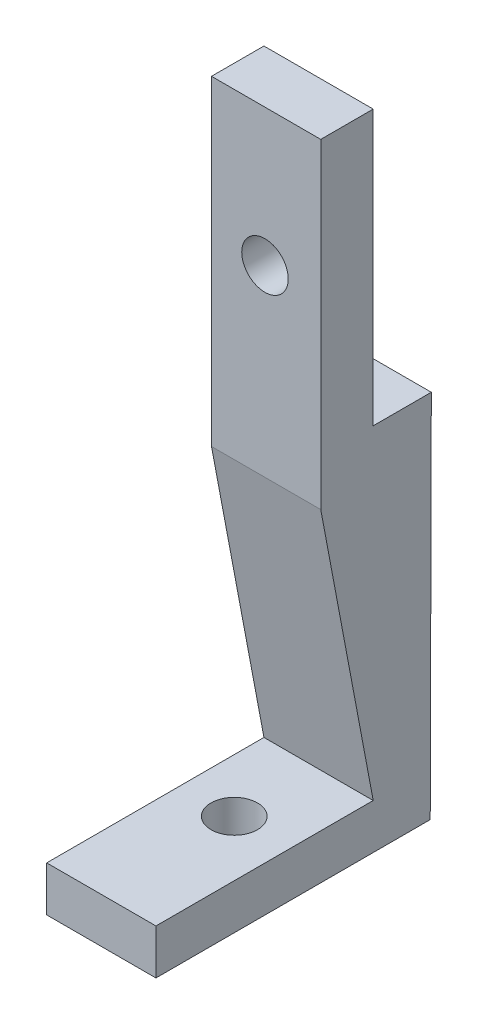
ISO-10303-21;
HEADER;
FILE_DESCRIPTION(('STEP AP214'),'2;1');
FILE_NAME('part.step','',(''),(''),'','','');
FILE_SCHEMA(('AUTOMOTIVE_DESIGN { 1 0 10303 214 1 1 1 1 }'));
ENDSEC;
DATA;
#1=APPLICATION_CONTEXT('core data for automotive mechanical design processes');
#2=APPLICATION_PROTOCOL_DEFINITION('international standard','automotive_design',2000,#1);
#3=PRODUCT_CONTEXT('',#1,'mechanical');
#4=PRODUCT('Part','Part','',(#3));
#5=PRODUCT_RELATED_PRODUCT_CATEGORY('part','',(#4));
#6=PRODUCT_DEFINITION_FORMATION('','',#4);
#7=PRODUCT_DEFINITION_CONTEXT('part definition',#1,'design');
#8=PRODUCT_DEFINITION('design','',#6,#7);
#9=PRODUCT_DEFINITION_SHAPE('','',#8);
#10=(LENGTH_UNIT() NAMED_UNIT(*) SI_UNIT(.MILLI.,.METRE.));
#11=(NAMED_UNIT(*) PLANE_ANGLE_UNIT() SI_UNIT($,.RADIAN.));
#12=(NAMED_UNIT(*) SI_UNIT($,.STERADIAN.) SOLID_ANGLE_UNIT());
#13=UNCERTAINTY_MEASURE_WITH_UNIT(LENGTH_MEASURE(1.E-05),#10,'distance_accuracy_value','');
#14=(GEOMETRIC_REPRESENTATION_CONTEXT(3) GLOBAL_UNCERTAINTY_ASSIGNED_CONTEXT((#13)) GLOBAL_UNIT_ASSIGNED_CONTEXT((#10,
#11,#12)) REPRESENTATION_CONTEXT('',''));
#15=CARTESIAN_POINT('',(0.,0.,0.));
#16=DIRECTION('',(0.,0.,1.));
#17=DIRECTION('',(1.,0.,0.));
#18=AXIS2_PLACEMENT_3D('',#15,#16,#17);
#19=CARTESIAN_POINT('',(4.7,27.6999999999997,4.70976625159633));
#20=DIRECTION('',(0.,-1.,0.));
#21=DIRECTION('',(0.,0.,-1.));
#22=AXIS2_PLACEMENT_3D('',#19,#20,#21);
#23=PLANE('',#22);
#24=DIRECTION('',(0.,0.,1.));
#25=VECTOR('',#24,1.);
#26=CARTESIAN_POINT('',(0.,27.6999999999997,4.70976625159633));
#27=LINE('',#26,#25);
#28=CARTESIAN_POINT('',(0.,27.6999999999997,2.45350347609655));
#29=VERTEX_POINT('',#28);
#30=CARTESIAN_POINT('',(0.,27.6999999999997,4.70976625159633));
#31=VERTEX_POINT('',#30);
#32=EDGE_CURVE('E143',#29,#31,#27,.T.);
#33=ORIENTED_EDGE('',*,*,#32,.T.);
#34=DIRECTION('',(-1.,0.,0.));
#35=VECTOR('',#34,1.);
#36=CARTESIAN_POINT('',(4.7,27.6999999999997,4.70976625159633));
#37=LINE('',#36,#35);
#38=CARTESIAN_POINT('',(4.7,27.6999999999997,4.70976625159633));
#39=VERTEX_POINT('',#38);
#40=EDGE_CURVE('E11',#39,#31,#37,.T.);
#41=ORIENTED_EDGE('',*,*,#40,.F.);
#42=DIRECTION('',(0.,0.,1.));
#43=VECTOR('',#42,1.);
#44=CARTESIAN_POINT('',(4.7,27.6999999999997,4.70976625159633));
#45=LINE('',#44,#43);
#46=CARTESIAN_POINT('',(4.7,27.6999999999997,2.45350347609655));
#47=VERTEX_POINT('',#46);
#48=EDGE_CURVE('E158',#47,#39,#45,.T.);
#49=ORIENTED_EDGE('',*,*,#48,.F.);
#50=DIRECTION('',(-1.,0.,0.));
#51=VECTOR('',#50,1.);
#52=CARTESIAN_POINT('',(4.7,27.6999999999997,2.45350347609655));
#53=LINE('',#52,#51);
#54=EDGE_CURVE('E140',#47,#29,#53,.T.);
#55=ORIENTED_EDGE('',*,*,#54,.T.);
#56=EDGE_LOOP('',(#33,#41,#49,#55));
#57=FACE_BOUND('',#56,.T.);
#58=ADVANCED_FACE('F39',(#57),#23,.F.);
#59=CARTESIAN_POINT('',(4.7,13.9090769259345,4.70976625159633));
#60=DIRECTION('',(0.,0.,-1.));
#61=DIRECTION('',(-1.,0.,0.));
#62=AXIS2_PLACEMENT_3D('',#59,#60,#61);
#63=PLANE('',#62);
#64=CARTESIAN_POINT('',(2.29999999999601,21.8000000000001,4.70976625159633));
#65=DIRECTION('',(0.,0.,-1.));
#66=DIRECTION('',(-1.,0.,0.));
#67=AXIS2_PLACEMENT_3D('',#64,#65,#66);
#68=CIRCLE('',#67,0.999999999995538);
#69=CARTESIAN_POINT('',(1.30000000000047,21.8000000000001,4.70976625159633));
#70=VERTEX_POINT('',#69);
#71=EDGE_CURVE('E144',#70,#70,#68,.T.);
#72=ORIENTED_EDGE('',*,*,#71,.T.);
#73=EDGE_LOOP('',(#72));
#74=FACE_BOUND('',#73,.T.);
#75=DIRECTION('',(0.,-1.,0.));
#76=VECTOR('',#75,1.);
#77=CARTESIAN_POINT('',(0.,13.9090769259345,4.70976625159633));
#78=LINE('',#77,#76);
#79=CARTESIAN_POINT('',(0.,13.9090769259345,4.70976625159633));
#80=VERTEX_POINT('',#79);
#81=EDGE_CURVE('E145',#31,#80,#78,.T.);
#82=ORIENTED_EDGE('',*,*,#81,.T.);
#83=DIRECTION('',(-1.,0.,0.));
#84=VECTOR('',#83,1.);
#85=CARTESIAN_POINT('',(4.7,13.9090769259345,4.70976625159633));
#86=LINE('',#85,#84);
#87=CARTESIAN_POINT('',(4.7,13.9090769259345,4.70976625159633));
#88=VERTEX_POINT('',#87);
#89=EDGE_CURVE('E50',#88,#80,#86,.T.);
#90=ORIENTED_EDGE('',*,*,#89,.F.);
#91=DIRECTION('',(0.,-1.,0.));
#92=VECTOR('',#91,1.);
#93=CARTESIAN_POINT('',(4.7,13.9090769259345,4.70976625159633));
#94=LINE('',#93,#92);
#95=EDGE_CURVE('E101',#39,#88,#94,.T.);
#96=ORIENTED_EDGE('',*,*,#95,.F.);
#97=ORIENTED_EDGE('',*,*,#40,.T.);
#98=EDGE_LOOP('',(#82,#90,#96,#97));
#99=FACE_BOUND('',#98,.T.);
#100=ADVANCED_FACE('F237',(#74,#99),#63,.F.);
#101=CARTESIAN_POINT('',(4.7,13.9090769259345,4.70976625159633));
#102=DIRECTION('',(0.,0.185238207740741,-0.982693648291775));
#103=DIRECTION('',(0.,0.982693648291775,0.185238207740741));
#104=AXIS2_PLACEMENT_3D('',#101,#102,#103);
#105=PLANE('',#104);
#106=DIRECTION('',(0.,-0.982693648291775,-0.185238207740741));
#107=VECTOR('',#106,1.);
#108=CARTESIAN_POINT('',(0.,13.9090769259345,4.70976625159633));
#109=LINE('',#108,#107);
#110=CARTESIAN_POINT('',(0.,1.93954253341857,2.45350347609655));
#111=VERTEX_POINT('',#110);
#112=EDGE_CURVE('E150',#80,#111,#109,.T.);
#113=ORIENTED_EDGE('',*,*,#112,.T.);
#114=DIRECTION('',(-1.,0.,0.));
#115=VECTOR('',#114,1.);
#116=CARTESIAN_POINT('',(4.7,1.93954253341857,2.45350347609655));
#117=LINE('',#116,#115);
#118=CARTESIAN_POINT('',(4.7,1.93954253341857,2.45350347609655));
#119=VERTEX_POINT('',#118);
#120=EDGE_CURVE('E169',#119,#111,#117,.T.);
#121=ORIENTED_EDGE('',*,*,#120,.F.);
#122=DIRECTION('',(0.,-0.982693648291775,-0.185238207740741));
#123=VECTOR('',#122,1.);
#124=CARTESIAN_POINT('',(4.7,13.9090769259345,4.70976625159633));
#125=LINE('',#124,#123);
#126=EDGE_CURVE('E177',#88,#119,#125,.T.);
#127=ORIENTED_EDGE('',*,*,#126,.F.);
#128=ORIENTED_EDGE('',*,*,#89,.T.);
#129=EDGE_LOOP('',(#113,#121,#127,#128));
#130=FACE_BOUND('',#129,.T.);
#131=ADVANCED_FACE('F173',(#130),#105,.F.);
#132=CARTESIAN_POINT('',(4.7,1.93954253341857,11.8));
#133=DIRECTION('',(0.,-1.,0.));
#134=DIRECTION('',(0.,0.,-1.));
#135=AXIS2_PLACEMENT_3D('',#132,#133,#134);
#136=PLANE('',#135);
#137=CARTESIAN_POINT('',(2.29999999999615,1.93954253341857,6.03102558482396));
#138=DIRECTION('',(0.,-1.,0.));
#139=DIRECTION('',(0.,0.,-1.));
#140=AXIS2_PLACEMENT_3D('',#137,#138,#139);
#141=CIRCLE('',#140,0.999999999999455);
#142=CARTESIAN_POINT('',(2.29999999999615,1.93954253341857,5.0310255848245));
#143=VERTEX_POINT('',#142);
#144=EDGE_CURVE('E204',#143,#143,#141,.T.);
#145=ORIENTED_EDGE('',*,*,#144,.T.);
#146=EDGE_LOOP('',(#145));
#147=FACE_BOUND('',#146,.T.);
#148=DIRECTION('',(0.,0.,1.));
#149=VECTOR('',#148,1.);
#150=CARTESIAN_POINT('',(0.,1.93954253341857,11.8));
#151=LINE('',#150,#149);
#152=CARTESIAN_POINT('',(0.,1.93954253341857,11.8));
#153=VERTEX_POINT('',#152);
#154=EDGE_CURVE('E149',#111,#153,#151,.T.);
#155=ORIENTED_EDGE('',*,*,#154,.T.);
#156=DIRECTION('',(-1.,0.,0.));
#157=VECTOR('',#156,1.);
#158=CARTESIAN_POINT('',(4.7,1.93954253341857,11.8));
#159=LINE('',#158,#157);
#160=CARTESIAN_POINT('',(4.7,1.93954253341857,11.8));
#161=VERTEX_POINT('',#160);
#162=EDGE_CURVE('E164',#161,#153,#159,.T.);
#163=ORIENTED_EDGE('',*,*,#162,.F.);
#164=DIRECTION('',(0.,0.,1.));
#165=VECTOR('',#164,1.);
#166=CARTESIAN_POINT('',(4.7,1.93954253341857,11.8));
#167=LINE('',#166,#165);
#168=EDGE_CURVE('E195',#119,#161,#167,.T.);
#169=ORIENTED_EDGE('',*,*,#168,.F.);
#170=ORIENTED_EDGE('',*,*,#120,.T.);
#171=EDGE_LOOP('',(#155,#163,#169,#170));
#172=FACE_BOUND('',#171,.T.);
#173=ADVANCED_FACE('F183',(#147,#172),#136,.F.);
#174=CARTESIAN_POINT('',(4.7,0.,11.8));
#175=DIRECTION('',(0.,0.,-1.));
#176=DIRECTION('',(-1.,0.,0.));
#177=AXIS2_PLACEMENT_3D('',#174,#175,#176);
#178=PLANE('',#177);
#179=DIRECTION('',(0.,-1.,0.));
#180=VECTOR('',#179,1.);
#181=CARTESIAN_POINT('',(0.,0.,11.8));
#182=LINE('',#181,#180);
#183=CARTESIAN_POINT('',(0.,0.,11.8));
#184=VERTEX_POINT('',#183);
#185=EDGE_CURVE('E151',#153,#184,#182,.T.);
#186=ORIENTED_EDGE('',*,*,#185,.T.);
#187=DIRECTION('',(-1.,0.,0.));
#188=VECTOR('',#187,1.);
#189=CARTESIAN_POINT('',(4.7,0.,11.8));
#190=LINE('',#189,#188);
#191=CARTESIAN_POINT('',(4.7,0.,11.8));
#192=VERTEX_POINT('',#191);
#193=EDGE_CURVE('E165',#192,#184,#190,.T.);
#194=ORIENTED_EDGE('',*,*,#193,.F.);
#195=DIRECTION('',(0.,-1.,0.));
#196=VECTOR('',#195,1.);
#197=CARTESIAN_POINT('',(4.7,0.,11.8));
#198=LINE('',#197,#196);
#199=EDGE_CURVE('E192',#161,#192,#198,.T.);
#200=ORIENTED_EDGE('',*,*,#199,.F.);
#201=ORIENTED_EDGE('',*,*,#162,.T.);
#202=EDGE_LOOP('',(#186,#194,#200,#201));
#203=FACE_BOUND('',#202,.T.);
#204=ADVANCED_FACE('F188',(#203),#178,.F.);
#205=CARTESIAN_POINT('',(4.7,0.,0.));
#206=DIRECTION('',(0.,1.,0.));
#207=DIRECTION('',(0.,0.,1.));
#208=AXIS2_PLACEMENT_3D('',#205,#206,#207);
#209=PLANE('',#208);
#210=CARTESIAN_POINT('',(2.29999999999615,0.,6.03102558482396));
#211=DIRECTION('',(0.,-1.,0.));
#212=DIRECTION('',(0.,0.,-1.));
#213=AXIS2_PLACEMENT_3D('',#210,#211,#212);
#214=CIRCLE('',#213,0.999999999999455);
#215=CARTESIAN_POINT('',(2.29999999999615,0.,5.0310255848245));
#216=VERTEX_POINT('',#215);
#217=EDGE_CURVE('E210',#216,#216,#214,.T.);
#218=ORIENTED_EDGE('',*,*,#217,.F.);
#219=EDGE_LOOP('',(#218));
#220=FACE_BOUND('',#219,.T.);
#221=DIRECTION('',(0.,0.,-1.));
#222=VECTOR('',#221,1.);
#223=CARTESIAN_POINT('',(0.,0.,0.));
#224=LINE('',#223,#222);
#225=CARTESIAN_POINT('',(0.,0.,0.));
#226=VERTEX_POINT('',#225);
#227=EDGE_CURVE('E153',#184,#226,#224,.T.);
#228=ORIENTED_EDGE('',*,*,#227,.T.);
#229=DIRECTION('',(-1.,0.,0.));
#230=VECTOR('',#229,1.);
#231=CARTESIAN_POINT('',(4.7,0.,0.));
#232=LINE('',#231,#230);
#233=CARTESIAN_POINT('',(4.7,0.,0.));
#234=VERTEX_POINT('',#233);
#235=EDGE_CURVE('E132',#234,#226,#232,.T.);
#236=ORIENTED_EDGE('',*,*,#235,.F.);
#237=DIRECTION('',(0.,0.,-1.));
#238=VECTOR('',#237,1.);
#239=CARTESIAN_POINT('',(4.7,0.,0.));
#240=LINE('',#239,#238);
#241=EDGE_CURVE('E124',#192,#234,#240,.T.);
#242=ORIENTED_EDGE('',*,*,#241,.F.);
#243=ORIENTED_EDGE('',*,*,#193,.T.);
#244=EDGE_LOOP('',(#228,#236,#242,#243));
#245=FACE_BOUND('',#244,.T.);
#246=ADVANCED_FACE('F212',(#220,#245),#209,.F.);
#247=CARTESIAN_POINT('',(4.7,15.8999999999996,-0.0464965239034536));
#248=DIRECTION('',(0.,0.00292429717579829,0.999995724233873));
#249=DIRECTION('',(0.,-0.999995724233873,0.00292429717579829));
#250=AXIS2_PLACEMENT_3D('',#247,#248,#249);
#251=PLANE('',#250);
#252=DIRECTION('',(0.,0.999995724233873,-0.00292429717579829));
#253=VECTOR('',#252,1.);
#254=CARTESIAN_POINT('',(0.,15.8999999999996,-0.0464965239034536));
#255=LINE('',#254,#253);
#256=CARTESIAN_POINT('',(0.,15.8999999999996,-0.0464965239034536));
#257=VERTEX_POINT('',#256);
#258=EDGE_CURVE('E131',#226,#257,#255,.T.);
#259=ORIENTED_EDGE('',*,*,#258,.T.);
#260=DIRECTION('',(-1.,0.,0.));
#261=VECTOR('',#260,1.);
#262=CARTESIAN_POINT('',(4.7,15.8999999999996,-0.0464965239034536));
#263=LINE('',#262,#261);
#264=CARTESIAN_POINT('',(4.7,15.8999999999996,-0.0464965239034536));
#265=VERTEX_POINT('',#264);
#266=EDGE_CURVE('E126',#265,#257,#263,.T.);
#267=ORIENTED_EDGE('',*,*,#266,.F.);
#268=DIRECTION('',(0.,0.999995724233873,-0.00292429717579829));
#269=VECTOR('',#268,1.);
#270=CARTESIAN_POINT('',(4.7,15.8999999999996,-0.0464965239034536));
#271=LINE('',#270,#269);
#272=EDGE_CURVE('E117',#234,#265,#271,.T.);
#273=ORIENTED_EDGE('',*,*,#272,.F.);
#274=ORIENTED_EDGE('',*,*,#235,.T.);
#275=EDGE_LOOP('',(#259,#267,#273,#274));
#276=FACE_BOUND('',#275,.T.);
#277=ADVANCED_FACE('F129',(#276),#251,.F.);
#278=CARTESIAN_POINT('',(4.7,15.8999999999996,2.45350347609654));
#279=DIRECTION('',(0.,-1.,0.));
#280=DIRECTION('',(0.,0.,-1.));
#281=AXIS2_PLACEMENT_3D('',#278,#279,#280);
#282=PLANE('',#281);
#283=DIRECTION('',(0.,0.,1.));
#284=VECTOR('',#283,1.);
#285=CARTESIAN_POINT('',(0.,15.8999999999996,2.45350347609654));
#286=LINE('',#285,#284);
#287=CARTESIAN_POINT('',(0.,15.8999999999996,2.45350347609654));
#288=VERTEX_POINT('',#287);
#289=EDGE_CURVE('E87',#257,#288,#286,.T.);
#290=ORIENTED_EDGE('',*,*,#289,.T.);
#291=DIRECTION('',(-1.,0.,0.));
#292=VECTOR('',#291,1.);
#293=CARTESIAN_POINT('',(4.7,15.8999999999996,2.45350347609654));
#294=LINE('',#293,#292);
#295=CARTESIAN_POINT('',(4.7,15.8999999999996,2.45350347609654));
#296=VERTEX_POINT('',#295);
#297=EDGE_CURVE('E134',#296,#288,#294,.T.);
#298=ORIENTED_EDGE('',*,*,#297,.F.);
#299=DIRECTION('',(0.,0.,1.));
#300=VECTOR('',#299,1.);
#301=CARTESIAN_POINT('',(4.7,15.8999999999996,2.45350347609654));
#302=LINE('',#301,#300);
#303=EDGE_CURVE('E122',#265,#296,#302,.T.);
#304=ORIENTED_EDGE('',*,*,#303,.F.);
#305=ORIENTED_EDGE('',*,*,#266,.T.);
#306=EDGE_LOOP('',(#290,#298,#304,#305));
#307=FACE_BOUND('',#306,.T.);
#308=ADVANCED_FACE('F135',(#307),#282,.F.);
#309=CARTESIAN_POINT('',(4.7,27.6999999999997,2.45350347609655));
#310=DIRECTION('',(0.,0.,1.));
#311=DIRECTION('',(0.,-1.,0.));
#312=AXIS2_PLACEMENT_3D('',#309,#310,#311);
#313=PLANE('',#312);
#314=CARTESIAN_POINT('',(2.29999999999601,21.8000000000001,2.45350347609654));
#315=DIRECTION('',(0.,0.,-1.));
#316=DIRECTION('',(0.,1.,0.));
#317=AXIS2_PLACEMENT_3D('',#314,#315,#316);
#318=CIRCLE('',#317,0.999999999995538);
#319=CARTESIAN_POINT('',(2.29999999999601,22.7999999999956,2.45350347609654));
#320=VERTEX_POINT('',#319);
#321=EDGE_CURVE('E203',#320,#320,#318,.T.);
#322=ORIENTED_EDGE('',*,*,#321,.F.);
#323=EDGE_LOOP('',(#322));
#324=FACE_BOUND('',#323,.T.);
#325=DIRECTION('',(0.,1.,0.));
#326=VECTOR('',#325,1.);
#327=CARTESIAN_POINT('',(0.,27.6999999999997,2.45350347609655));
#328=LINE('',#327,#326);
#329=EDGE_CURVE('E91',#288,#29,#328,.T.);
#330=ORIENTED_EDGE('',*,*,#329,.T.);
#331=ORIENTED_EDGE('',*,*,#54,.F.);
#332=DIRECTION('',(0.,1.,0.));
#333=VECTOR('',#332,1.);
#334=CARTESIAN_POINT('',(4.7,27.6999999999997,2.45350347609655));
#335=LINE('',#334,#333);
#336=EDGE_CURVE('E54',#296,#47,#335,.T.);
#337=ORIENTED_EDGE('',*,*,#336,.F.);
#338=ORIENTED_EDGE('',*,*,#297,.T.);
#339=EDGE_LOOP('',(#330,#331,#337,#338));
#340=FACE_BOUND('',#339,.T.);
#341=ADVANCED_FACE('F222',(#324,#340),#313,.F.);
#342=CARTESIAN_POINT('',(4.7,0.,0.));
#343=DIRECTION('',(-1.,0.,0.));
#344=DIRECTION('',(0.,0.,1.));
#345=AXIS2_PLACEMENT_3D('',#342,#343,#344);
#346=PLANE('',#345);
#347=ORIENTED_EDGE('',*,*,#48,.T.);
#348=ORIENTED_EDGE('',*,*,#95,.T.);
#349=ORIENTED_EDGE('',*,*,#126,.T.);
#350=ORIENTED_EDGE('',*,*,#168,.T.);
#351=ORIENTED_EDGE('',*,*,#199,.T.);
#352=ORIENTED_EDGE('',*,*,#241,.T.);
#353=ORIENTED_EDGE('',*,*,#272,.T.);
#354=ORIENTED_EDGE('',*,*,#303,.T.);
#355=ORIENTED_EDGE('',*,*,#336,.T.);
#356=EDGE_LOOP('',(#347,#348,#349,#350,#351,#352,#353,#354,#355));
#357=FACE_BOUND('',#356,.T.);
#358=ADVANCED_FACE('F118',(#357),#346,.F.);
#359=CARTESIAN_POINT('',(0.,0.,0.));
#360=DIRECTION('',(-1.,0.,0.));
#361=DIRECTION('',(0.,0.,1.));
#362=AXIS2_PLACEMENT_3D('',#359,#360,#361);
#363=PLANE('',#362);
#364=ORIENTED_EDGE('',*,*,#32,.F.);
#365=ORIENTED_EDGE('',*,*,#329,.F.);
#366=ORIENTED_EDGE('',*,*,#289,.F.);
#367=ORIENTED_EDGE('',*,*,#258,.F.);
#368=ORIENTED_EDGE('',*,*,#227,.F.);
#369=ORIENTED_EDGE('',*,*,#185,.F.);
#370=ORIENTED_EDGE('',*,*,#154,.F.);
#371=ORIENTED_EDGE('',*,*,#112,.F.);
#372=ORIENTED_EDGE('',*,*,#81,.F.);
#373=EDGE_LOOP('',(#364,#365,#366,#367,#368,#369,#370,#371,#372));
#374=FACE_BOUND('',#373,.T.);
#375=ADVANCED_FACE('F178',(#374),#363,.T.);
#376=CARTESIAN_POINT('',(2.29999999999601,21.8000000000001,7.15350347609654));
#377=DIRECTION('',(0.,0.,-1.));
#378=DIRECTION('',(0.,1.,0.));
#379=AXIS2_PLACEMENT_3D('',#376,#377,#378);
#380=CYLINDRICAL_SURFACE('',#379,0.999999999995538);
#381=ORIENTED_EDGE('',*,*,#321,.T.);
#382=EDGE_LOOP('',(#381));
#383=FACE_BOUND('',#382,.T.);
#384=ORIENTED_EDGE('',*,*,#71,.F.);
#385=EDGE_LOOP('',(#384));
#386=FACE_BOUND('',#385,.T.);
#387=ADVANCED_FACE('F267',(#383,#386),#380,.F.);
#388=CARTESIAN_POINT('',(2.29999999999615,4.7,6.03102558482396));
#389=DIRECTION('',(0.,-1.,0.));
#390=DIRECTION('',(0.,0.,-1.));
#391=AXIS2_PLACEMENT_3D('',#388,#389,#390);
#392=CYLINDRICAL_SURFACE('',#391,0.999999999999455);
#393=ORIENTED_EDGE('',*,*,#217,.T.);
#394=EDGE_LOOP('',(#393));
#395=FACE_BOUND('',#394,.T.);
#396=ORIENTED_EDGE('',*,*,#144,.F.);
#397=EDGE_LOOP('',(#396));
#398=FACE_BOUND('',#397,.T.);
#399=ADVANCED_FACE('F211',(#395,#398),#392,.F.);
#400=CLOSED_SHELL('',(#58,#100,#131,#173,#204,#246,#277,#308,#341,#358,#375,#387,#399));
#401=MANIFOLD_SOLID_BREP('B2',#400);
#402=ADVANCED_BREP_SHAPE_REPRESENTATION('',(#18,#401),#14);
#403=SHAPE_DEFINITION_REPRESENTATION(#9,#402);
ENDSEC;
END-ISO-10303-21;
